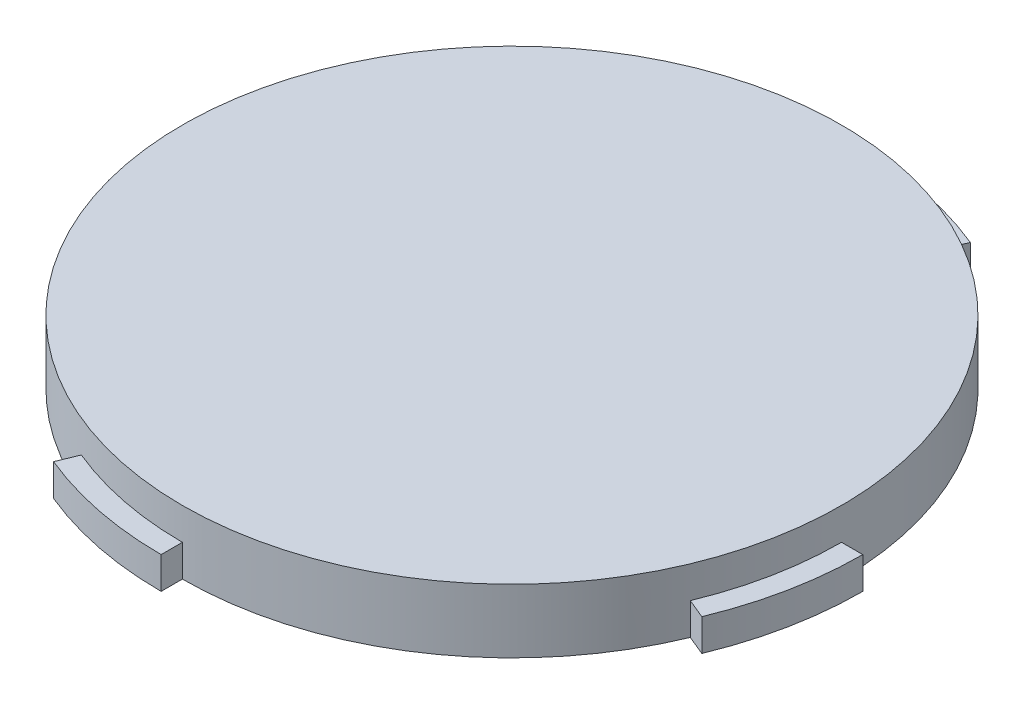
ISO-10303-21;
HEADER;
FILE_DESCRIPTION(('STEP AP214'),'2;1');
FILE_NAME('part.step','',(''),(''),'','','');
FILE_SCHEMA(('AUTOMOTIVE_DESIGN { 1 0 10303 214 1 1 1 1 }'));
ENDSEC;
DATA;
#1=APPLICATION_CONTEXT('core data for automotive mechanical design processes');
#2=APPLICATION_PROTOCOL_DEFINITION('international standard','automotive_design',2000,#1);
#3=PRODUCT_CONTEXT('',#1,'mechanical');
#4=PRODUCT('Part','Part','',(#3));
#5=PRODUCT_RELATED_PRODUCT_CATEGORY('part','',(#4));
#6=PRODUCT_DEFINITION_FORMATION('','',#4);
#7=PRODUCT_DEFINITION_CONTEXT('part definition',#1,'design');
#8=PRODUCT_DEFINITION('design','',#6,#7);
#9=PRODUCT_DEFINITION_SHAPE('','',#8);
#10=(LENGTH_UNIT() NAMED_UNIT(*) SI_UNIT(.MILLI.,.METRE.));
#11=(NAMED_UNIT(*) PLANE_ANGLE_UNIT() SI_UNIT($,.RADIAN.));
#12=(NAMED_UNIT(*) SI_UNIT($,.STERADIAN.) SOLID_ANGLE_UNIT());
#13=UNCERTAINTY_MEASURE_WITH_UNIT(LENGTH_MEASURE(1.E-05),#10,'distance_accuracy_value','');
#14=(GEOMETRIC_REPRESENTATION_CONTEXT(3) GLOBAL_UNCERTAINTY_ASSIGNED_CONTEXT((#13)) GLOBAL_UNIT_ASSIGNED_CONTEXT((#10,
#11,#12)) REPRESENTATION_CONTEXT('',''));
#15=CARTESIAN_POINT('',(0.,0.,0.));
#16=DIRECTION('',(0.,0.,1.));
#17=DIRECTION('',(1.,0.,0.));
#18=AXIS2_PLACEMENT_3D('',#15,#16,#17);
#19=CARTESIAN_POINT('',(0.,3.,0.));
#20=DIRECTION('',(0.,1.,0.));
#21=DIRECTION('',(0.,0.,1.));
#22=AXIS2_PLACEMENT_3D('',#19,#20,#21);
#23=PLANE('',#22);
#24=CARTESIAN_POINT('',(0.,3.,0.));
#25=DIRECTION('',(0.,1.,0.));
#26=DIRECTION('',(0.,0.,1.));
#27=AXIS2_PLACEMENT_3D('',#24,#25,#26);
#28=CIRCLE('',#27,31.);
#29=CARTESIAN_POINT('',(28.6402655078499,3.,11.8631864033178));
#30=VERTEX_POINT('',#29);
#31=CARTESIAN_POINT('',(31.,3.,0.));
#32=VERTEX_POINT('',#31);
#33=EDGE_CURVE('E11',#30,#32,#28,.T.);
#34=ORIENTED_EDGE('',*,*,#33,.F.);
#35=DIRECTION('',(0.923879532511287,0.,0.38268343236509));
#36=VECTOR('',#35,1.);
#37=CARTESIAN_POINT('',(0.,3.,0.));
#38=LINE('',#37,#36);
#39=CARTESIAN_POINT('',(30.4880245728725,3.,12.628553268048));
#40=VERTEX_POINT('',#39);
#41=EDGE_CURVE('E246',#30,#40,#38,.T.);
#42=ORIENTED_EDGE('',*,*,#41,.T.);
#43=CARTESIAN_POINT('',(0.,3.,0.));
#44=DIRECTION('',(0.,1.,0.));
#45=DIRECTION('',(0.,0.,1.));
#46=AXIS2_PLACEMENT_3D('',#43,#44,#45);
#47=CIRCLE('',#46,33.);
#48=CARTESIAN_POINT('',(33.,3.,0.));
#49=VERTEX_POINT('',#48);
#50=EDGE_CURVE('E335',#40,#49,#47,.T.);
#51=ORIENTED_EDGE('',*,*,#50,.T.);
#52=DIRECTION('',(1.,0.,0.));
#53=VECTOR('',#52,1.);
#54=CARTESIAN_POINT('',(0.,3.,0.));
#55=LINE('',#54,#53);
#56=EDGE_CURVE('E338',#32,#49,#55,.T.);
#57=ORIENTED_EDGE('',*,*,#56,.F.);
#58=EDGE_LOOP('',(#34,#42,#51,#57));
#59=FACE_BOUND('',#58,.T.);
#60=ADVANCED_FACE('F41',(#59),#23,.T.);
#61=CARTESIAN_POINT('',(11.8631864033178,3.,-28.6402655078499));
#62=VERTEX_POINT('',#61);
#63=CARTESIAN_POINT('',(0.,3.,-31.));
#64=VERTEX_POINT('',#63);
#65=EDGE_CURVE('E52',#62,#64,#28,.T.);
#66=ORIENTED_EDGE('',*,*,#65,.F.);
#67=DIRECTION('',(0.38268343236509,0.,-0.923879532511287));
#68=VECTOR('',#67,1.);
#69=CARTESIAN_POINT('',(0.,3.,0.));
#70=LINE('',#69,#68);
#71=CARTESIAN_POINT('',(12.628553268048,3.,-30.4880245728725));
#72=VERTEX_POINT('',#71);
#73=EDGE_CURVE('E342',#62,#72,#70,.T.);
#74=ORIENTED_EDGE('',*,*,#73,.T.);
#75=CARTESIAN_POINT('',(0.,3.,0.));
#76=DIRECTION('',(0.,1.,0.));
#77=DIRECTION('',(0.,0.,1.));
#78=AXIS2_PLACEMENT_3D('',#75,#76,#77);
#79=CIRCLE('',#78,33.);
#80=CARTESIAN_POINT('',(0.,3.,-33.));
#81=VERTEX_POINT('',#80);
#82=EDGE_CURVE('E345',#72,#81,#79,.T.);
#83=ORIENTED_EDGE('',*,*,#82,.T.);
#84=DIRECTION('',(0.,0.,1.));
#85=VECTOR('',#84,1.);
#86=CARTESIAN_POINT('',(0.,3.,0.));
#87=LINE('',#86,#85);
#88=EDGE_CURVE('E348',#81,#64,#87,.T.);
#89=ORIENTED_EDGE('',*,*,#88,.T.);
#90=EDGE_LOOP('',(#66,#74,#83,#89));
#91=FACE_BOUND('',#90,.T.);
#92=ADVANCED_FACE('F314',(#91),#23,.T.);
#93=CARTESIAN_POINT('',(-28.6402655078499,3.,-11.8631864033178));
#94=VERTEX_POINT('',#93);
#95=CARTESIAN_POINT('',(-31.,3.,0.));
#96=VERTEX_POINT('',#95);
#97=EDGE_CURVE('E172',#94,#96,#28,.T.);
#98=ORIENTED_EDGE('',*,*,#97,.F.);
#99=DIRECTION('',(0.923879532511287,0.,0.38268343236509));
#100=VECTOR('',#99,1.);
#101=CARTESIAN_POINT('',(0.,3.,0.));
#102=LINE('',#101,#100);
#103=CARTESIAN_POINT('',(-30.4880245728725,3.,-12.628553268048));
#104=VERTEX_POINT('',#103);
#105=EDGE_CURVE('E351',#104,#94,#102,.T.);
#106=ORIENTED_EDGE('',*,*,#105,.F.);
#107=CARTESIAN_POINT('',(0.,3.,0.));
#108=DIRECTION('',(0.,1.,0.));
#109=DIRECTION('',(0.,0.,1.));
#110=AXIS2_PLACEMENT_3D('',#107,#108,#109);
#111=CIRCLE('',#110,33.);
#112=CARTESIAN_POINT('',(-33.,3.,0.));
#113=VERTEX_POINT('',#112);
#114=EDGE_CURVE('E194',#104,#113,#111,.T.);
#115=ORIENTED_EDGE('',*,*,#114,.T.);
#116=DIRECTION('',(1.,0.,0.));
#117=VECTOR('',#116,1.);
#118=CARTESIAN_POINT('',(0.,3.,0.));
#119=LINE('',#118,#117);
#120=EDGE_CURVE('E189',#113,#96,#119,.T.);
#121=ORIENTED_EDGE('',*,*,#120,.T.);
#122=EDGE_LOOP('',(#98,#106,#115,#121));
#123=FACE_BOUND('',#122,.T.);
#124=ADVANCED_FACE('F309',(#123),#23,.T.);
#125=CARTESIAN_POINT('',(0.,3.,0.));
#126=DIRECTION('',(0.38268343236509,0.,-0.923879532511287));
#127=DIRECTION('',(-0.923879532511287,0.,-0.38268343236509));
#128=AXIS2_PLACEMENT_3D('',#125,#126,#127);
#129=PLANE('',#128);
#130=DIRECTION('',(0.923879532511287,0.,0.38268343236509));
#131=VECTOR('',#130,1.);
#132=CARTESIAN_POINT('',(0.,0.,0.));
#133=LINE('',#132,#131);
#134=CARTESIAN_POINT('',(28.6402655078499,0.,11.8631864033178));
#135=VERTEX_POINT('',#134);
#136=CARTESIAN_POINT('',(30.4880245728725,0.,12.628553268048));
#137=VERTEX_POINT('',#136);
#138=EDGE_CURVE('E203',#135,#137,#133,.T.);
#139=ORIENTED_EDGE('',*,*,#138,.T.);
#140=DIRECTION('',(0.,-1.,0.));
#141=VECTOR('',#140,1.);
#142=CARTESIAN_POINT('',(30.4880245728725,3.,12.628553268048));
#143=LINE('',#142,#141);
#144=EDGE_CURVE('E286',#40,#137,#143,.T.);
#145=ORIENTED_EDGE('',*,*,#144,.F.);
#146=ORIENTED_EDGE('',*,*,#41,.F.);
#147=DIRECTION('',(0.,-1.,0.));
#148=VECTOR('',#147,1.);
#149=CARTESIAN_POINT('',(28.6402655078499,3.,11.8631864033178));
#150=LINE('',#149,#148);
#151=EDGE_CURVE('E45',#30,#135,#150,.T.);
#152=ORIENTED_EDGE('',*,*,#151,.T.);
#153=EDGE_LOOP('',(#139,#145,#146,#152));
#154=FACE_BOUND('',#153,.T.);
#155=ADVANCED_FACE('F43',(#154),#129,.F.);
#156=CARTESIAN_POINT('',(0.,3.,0.));
#157=DIRECTION('',(0.,-1.,0.));
#158=DIRECTION('',(0.,0.,-1.));
#159=AXIS2_PLACEMENT_3D('',#156,#157,#158);
#160=CYLINDRICAL_SURFACE('',#159,33.);
#161=CARTESIAN_POINT('',(0.,0.,0.));
#162=DIRECTION('',(0.,1.,0.));
#163=DIRECTION('',(0.,0.,1.));
#164=AXIS2_PLACEMENT_3D('',#161,#162,#163);
#165=CIRCLE('',#164,33.);
#166=CARTESIAN_POINT('',(33.,0.,0.));
#167=VERTEX_POINT('',#166);
#168=EDGE_CURVE('E208',#137,#167,#165,.T.);
#169=ORIENTED_EDGE('',*,*,#168,.T.);
#170=DIRECTION('',(0.,-1.,0.));
#171=VECTOR('',#170,1.);
#172=CARTESIAN_POINT('',(33.,3.,0.));
#173=LINE('',#172,#171);
#174=EDGE_CURVE('E284',#49,#167,#173,.T.);
#175=ORIENTED_EDGE('',*,*,#174,.F.);
#176=ORIENTED_EDGE('',*,*,#50,.F.);
#177=ORIENTED_EDGE('',*,*,#144,.T.);
#178=EDGE_LOOP('',(#169,#175,#176,#177));
#179=FACE_BOUND('',#178,.T.);
#180=ADVANCED_FACE('F409',(#179),#160,.T.);
#181=CARTESIAN_POINT('',(0.,3.,0.));
#182=DIRECTION('',(0.,0.,-1.));
#183=DIRECTION('',(-1.,0.,0.));
#184=AXIS2_PLACEMENT_3D('',#181,#182,#183);
#185=PLANE('',#184);
#186=DIRECTION('',(1.,0.,0.));
#187=VECTOR('',#186,1.);
#188=CARTESIAN_POINT('',(0.,0.,0.));
#189=LINE('',#188,#187);
#190=CARTESIAN_POINT('',(31.,0.,0.));
#191=VERTEX_POINT('',#190);
#192=EDGE_CURVE('E212',#191,#167,#189,.T.);
#193=ORIENTED_EDGE('',*,*,#192,.F.);
#194=DIRECTION('',(0.,-1.,0.));
#195=VECTOR('',#194,1.);
#196=CARTESIAN_POINT('',(31.,3.,0.));
#197=LINE('',#196,#195);
#198=EDGE_CURVE('E281',#32,#191,#197,.T.);
#199=ORIENTED_EDGE('',*,*,#198,.F.);
#200=ORIENTED_EDGE('',*,*,#56,.T.);
#201=ORIENTED_EDGE('',*,*,#174,.T.);
#202=EDGE_LOOP('',(#193,#199,#200,#201));
#203=FACE_BOUND('',#202,.T.);
#204=ADVANCED_FACE('F404',(#203),#185,.T.);
#205=CARTESIAN_POINT('',(0.,3.,0.));
#206=DIRECTION('',(-0.923879532511286,0.,-0.38268343236509));
#207=DIRECTION('',(-0.38268343236509,0.,0.923879532511287));
#208=AXIS2_PLACEMENT_3D('',#205,#206,#207);
#209=PLANE('',#208);
#210=DIRECTION('',(0.38268343236509,0.,-0.923879532511287));
#211=VECTOR('',#210,1.);
#212=CARTESIAN_POINT('',(0.,0.,0.));
#213=LINE('',#212,#211);
#214=CARTESIAN_POINT('',(11.8631864033178,0.,-28.6402655078499));
#215=VERTEX_POINT('',#214);
#216=CARTESIAN_POINT('',(12.628553268048,0.,-30.4880245728725));
#217=VERTEX_POINT('',#216);
#218=EDGE_CURVE('E216',#215,#217,#213,.T.);
#219=ORIENTED_EDGE('',*,*,#218,.T.);
#220=DIRECTION('',(0.,-1.,0.));
#221=VECTOR('',#220,1.);
#222=CARTESIAN_POINT('',(12.628553268048,3.,-30.4880245728725));
#223=LINE('',#222,#221);
#224=EDGE_CURVE('E273',#72,#217,#223,.T.);
#225=ORIENTED_EDGE('',*,*,#224,.F.);
#226=ORIENTED_EDGE('',*,*,#73,.F.);
#227=DIRECTION('',(0.,-1.,0.));
#228=VECTOR('',#227,1.);
#229=CARTESIAN_POINT('',(11.8631864033178,3.,-28.6402655078499));
#230=LINE('',#229,#228);
#231=EDGE_CURVE('E277',#62,#215,#230,.T.);
#232=ORIENTED_EDGE('',*,*,#231,.T.);
#233=EDGE_LOOP('',(#219,#225,#226,#232));
#234=FACE_BOUND('',#233,.T.);
#235=ADVANCED_FACE('F393',(#234),#209,.F.);
#236=CARTESIAN_POINT('',(0.,3.,0.));
#237=DIRECTION('',(0.,-1.,0.));
#238=DIRECTION('',(0.,0.,-1.));
#239=AXIS2_PLACEMENT_3D('',#236,#237,#238);
#240=CYLINDRICAL_SURFACE('',#239,33.);
#241=CARTESIAN_POINT('',(0.,0.,0.));
#242=DIRECTION('',(0.,1.,0.));
#243=DIRECTION('',(0.,0.,1.));
#244=AXIS2_PLACEMENT_3D('',#241,#242,#243);
#245=CIRCLE('',#244,33.);
#246=CARTESIAN_POINT('',(0.,0.,-33.));
#247=VERTEX_POINT('',#246);
#248=EDGE_CURVE('E219',#217,#247,#245,.T.);
#249=ORIENTED_EDGE('',*,*,#248,.T.);
#250=DIRECTION('',(0.,-1.,0.));
#251=VECTOR('',#250,1.);
#252=CARTESIAN_POINT('',(0.,3.,-33.));
#253=LINE('',#252,#251);
#254=EDGE_CURVE('E269',#81,#247,#253,.T.);
#255=ORIENTED_EDGE('',*,*,#254,.F.);
#256=ORIENTED_EDGE('',*,*,#82,.F.);
#257=ORIENTED_EDGE('',*,*,#224,.T.);
#258=EDGE_LOOP('',(#249,#255,#256,#257));
#259=FACE_BOUND('',#258,.T.);
#260=ADVANCED_FACE('F395',(#259),#240,.T.);
#261=CARTESIAN_POINT('',(0.,3.,0.));
#262=DIRECTION('',(1.,0.,0.));
#263=DIRECTION('',(0.,0.,-1.));
#264=AXIS2_PLACEMENT_3D('',#261,#262,#263);
#265=PLANE('',#264);
#266=DIRECTION('',(0.,0.,1.));
#267=VECTOR('',#266,1.);
#268=CARTESIAN_POINT('',(0.,0.,0.));
#269=LINE('',#268,#267);
#270=CARTESIAN_POINT('',(0.,0.,-31.));
#271=VERTEX_POINT('',#270);
#272=EDGE_CURVE('E222',#247,#271,#269,.T.);
#273=ORIENTED_EDGE('',*,*,#272,.T.);
#274=DIRECTION('',(0.,-1.,0.));
#275=VECTOR('',#274,1.);
#276=CARTESIAN_POINT('',(0.,3.,-31.));
#277=LINE('',#276,#275);
#278=EDGE_CURVE('E265',#64,#271,#277,.T.);
#279=ORIENTED_EDGE('',*,*,#278,.F.);
#280=ORIENTED_EDGE('',*,*,#88,.F.);
#281=ORIENTED_EDGE('',*,*,#254,.T.);
#282=EDGE_LOOP('',(#273,#279,#280,#281));
#283=FACE_BOUND('',#282,.T.);
#284=ADVANCED_FACE('F382',(#283),#265,.F.);
#285=CARTESIAN_POINT('',(0.,3.,0.));
#286=DIRECTION('',(0.382683432365089,0.,-0.923879532511287));
#287=DIRECTION('',(-0.923879532511287,0.,-0.38268343236509));
#288=AXIS2_PLACEMENT_3D('',#285,#286,#287);
#289=PLANE('',#288);
#290=DIRECTION('',(0.923879532511287,0.,0.38268343236509));
#291=VECTOR('',#290,1.);
#292=CARTESIAN_POINT('',(0.,0.,0.));
#293=LINE('',#292,#291);
#294=CARTESIAN_POINT('',(-30.4880245728725,0.,-12.628553268048));
#295=VERTEX_POINT('',#294);
#296=CARTESIAN_POINT('',(-28.6402655078499,0.,-11.8631864033178));
#297=VERTEX_POINT('',#296);
#298=EDGE_CURVE('E226',#295,#297,#293,.T.);
#299=ORIENTED_EDGE('',*,*,#298,.F.);
#300=DIRECTION('',(0.,-1.,0.));
#301=VECTOR('',#300,1.);
#302=CARTESIAN_POINT('',(-30.4880245728725,3.,-12.628553268048));
#303=LINE('',#302,#301);
#304=EDGE_CURVE('E259',#104,#295,#303,.T.);
#305=ORIENTED_EDGE('',*,*,#304,.F.);
#306=ORIENTED_EDGE('',*,*,#105,.T.);
#307=DIRECTION('',(0.,-1.,0.));
#308=VECTOR('',#307,1.);
#309=CARTESIAN_POINT('',(-28.6402655078499,3.,-11.8631864033178));
#310=LINE('',#309,#308);
#311=EDGE_CURVE('E262',#94,#297,#310,.T.);
#312=ORIENTED_EDGE('',*,*,#311,.T.);
#313=EDGE_LOOP('',(#299,#305,#306,#312));
#314=FACE_BOUND('',#313,.T.);
#315=ADVANCED_FACE('F402',(#314),#289,.T.);
#316=CARTESIAN_POINT('',(0.,3.,0.));
#317=DIRECTION('',(0.,-1.,0.));
#318=DIRECTION('',(0.,0.,-1.));
#319=AXIS2_PLACEMENT_3D('',#316,#317,#318);
#320=CYLINDRICAL_SURFACE('',#319,33.);
#321=CARTESIAN_POINT('',(0.,0.,0.));
#322=DIRECTION('',(0.,1.,0.));
#323=DIRECTION('',(0.,0.,1.));
#324=AXIS2_PLACEMENT_3D('',#321,#322,#323);
#325=CIRCLE('',#324,33.);
#326=CARTESIAN_POINT('',(-33.,0.,0.));
#327=VERTEX_POINT('',#326);
#328=EDGE_CURVE('E230',#295,#327,#325,.T.);
#329=ORIENTED_EDGE('',*,*,#328,.T.);
#330=DIRECTION('',(0.,-1.,0.));
#331=VECTOR('',#330,1.);
#332=CARTESIAN_POINT('',(-33.,3.,0.));
#333=LINE('',#332,#331);
#334=EDGE_CURVE('E255',#113,#327,#333,.T.);
#335=ORIENTED_EDGE('',*,*,#334,.F.);
#336=ORIENTED_EDGE('',*,*,#114,.F.);
#337=ORIENTED_EDGE('',*,*,#304,.T.);
#338=EDGE_LOOP('',(#329,#335,#336,#337));
#339=FACE_BOUND('',#338,.T.);
#340=ADVANCED_FACE('F362',(#339),#320,.T.);
#341=CARTESIAN_POINT('',(0.,3.,0.));
#342=DIRECTION('',(0.,0.,-1.));
#343=DIRECTION('',(-1.,0.,0.));
#344=AXIS2_PLACEMENT_3D('',#341,#342,#343);
#345=PLANE('',#344);
#346=DIRECTION('',(1.,0.,0.));
#347=VECTOR('',#346,1.);
#348=CARTESIAN_POINT('',(0.,0.,0.));
#349=LINE('',#348,#347);
#350=CARTESIAN_POINT('',(-31.,0.,0.));
#351=VERTEX_POINT('',#350);
#352=EDGE_CURVE('E233',#327,#351,#349,.T.);
#353=ORIENTED_EDGE('',*,*,#352,.T.);
#354=DIRECTION('',(0.,-1.,0.));
#355=VECTOR('',#354,1.);
#356=CARTESIAN_POINT('',(-31.,3.,0.));
#357=LINE('',#356,#355);
#358=EDGE_CURVE('E184',#96,#351,#357,.T.);
#359=ORIENTED_EDGE('',*,*,#358,.F.);
#360=ORIENTED_EDGE('',*,*,#120,.F.);
#361=ORIENTED_EDGE('',*,*,#334,.T.);
#362=EDGE_LOOP('',(#353,#359,#360,#361));
#363=FACE_BOUND('',#362,.T.);
#364=ADVANCED_FACE('F366',(#363),#345,.F.);
#365=CARTESIAN_POINT('',(0.,3.,0.));
#366=DIRECTION('',(0.,-1.,0.));
#367=DIRECTION('',(0.,0.,-1.));
#368=AXIS2_PLACEMENT_3D('',#365,#366,#367);
#369=CYLINDRICAL_SURFACE('',#368,31.);
#370=CARTESIAN_POINT('',(0.,0.,0.));
#371=DIRECTION('',(0.,1.,0.));
#372=DIRECTION('',(0.,0.,1.));
#373=AXIS2_PLACEMENT_3D('',#370,#371,#372);
#374=CIRCLE('',#373,31.);
#375=CARTESIAN_POINT('',(-11.8631864033178,0.,28.6402655078499));
#376=VERTEX_POINT('',#375);
#377=EDGE_CURVE('E179',#351,#376,#374,.T.);
#378=ORIENTED_EDGE('',*,*,#377,.T.);
#379=DIRECTION('',(0.,-1.,0.));
#380=VECTOR('',#379,1.);
#381=CARTESIAN_POINT('',(-11.8631864033178,3.,28.6402655078499));
#382=LINE('',#381,#380);
#383=CARTESIAN_POINT('',(-11.8631864033178,3.,28.6402655078499));
#384=VERTEX_POINT('',#383);
#385=EDGE_CURVE('E174',#384,#376,#382,.T.);
#386=ORIENTED_EDGE('',*,*,#385,.F.);
#387=CARTESIAN_POINT('',(0.,3.,31.));
#388=VERTEX_POINT('',#387);
#389=EDGE_CURVE('E54',#384,#388,#28,.T.);
#390=ORIENTED_EDGE('',*,*,#389,.T.);
#391=DIRECTION('',(0.,-1.,0.));
#392=VECTOR('',#391,1.);
#393=CARTESIAN_POINT('',(0.,3.,31.));
#394=LINE('',#393,#392);
#395=CARTESIAN_POINT('',(0.,0.,31.));
#396=VERTEX_POINT('',#395);
#397=EDGE_CURVE('E124',#388,#396,#394,.T.);
#398=ORIENTED_EDGE('',*,*,#397,.T.);
#399=EDGE_CURVE('E200',#396,#135,#374,.T.);
#400=ORIENTED_EDGE('',*,*,#399,.T.);
#401=ORIENTED_EDGE('',*,*,#151,.F.);
#402=ORIENTED_EDGE('',*,*,#33,.T.);
#403=ORIENTED_EDGE('',*,*,#198,.T.);
#404=EDGE_CURVE('E205',#191,#215,#374,.T.);
#405=ORIENTED_EDGE('',*,*,#404,.T.);
#406=ORIENTED_EDGE('',*,*,#231,.F.);
#407=ORIENTED_EDGE('',*,*,#65,.T.);
#408=ORIENTED_EDGE('',*,*,#278,.T.);
#409=EDGE_CURVE('E225',#271,#297,#374,.T.);
#410=ORIENTED_EDGE('',*,*,#409,.T.);
#411=ORIENTED_EDGE('',*,*,#311,.F.);
#412=ORIENTED_EDGE('',*,*,#97,.T.);
#413=ORIENTED_EDGE('',*,*,#358,.T.);
#414=EDGE_LOOP('',(#378,#386,#390,#398,#400,#401,#402,#403,#405,#406,#407,#408,#410,#411,#412,#413));
#415=FACE_BOUND('',#414,.T.);
#416=CARTESIAN_POINT('',(0.,6.,0.));
#417=DIRECTION('',(0.,1.,0.));
#418=DIRECTION('',(0.,0.,1.));
#419=AXIS2_PLACEMENT_3D('',#416,#417,#418);
#420=CIRCLE('',#419,31.);
#421=CARTESIAN_POINT('',(0.,6.,31.));
#422=VERTEX_POINT('',#421);
#423=EDGE_CURVE('E204',#422,#422,#420,.T.);
#424=ORIENTED_EDGE('',*,*,#423,.F.);
#425=EDGE_LOOP('',(#424));
#426=FACE_BOUND('',#425,.T.);
#427=ADVANCED_FACE('F175',(#415,#426),#369,.T.);
#428=CARTESIAN_POINT('',(0.,3.,0.));
#429=DIRECTION('',(-0.923879532511287,0.,-0.38268343236509));
#430=DIRECTION('',(-0.38268343236509,0.,0.923879532511287));
#431=AXIS2_PLACEMENT_3D('',#428,#429,#430);
#432=PLANE('',#431);
#433=DIRECTION('',(0.38268343236509,0.,-0.923879532511287));
#434=VECTOR('',#433,1.);
#435=CARTESIAN_POINT('',(0.,0.,0.));
#436=LINE('',#435,#434);
#437=CARTESIAN_POINT('',(-12.628553268048,0.,30.4880245728725));
#438=VERTEX_POINT('',#437);
#439=EDGE_CURVE('E236',#438,#376,#436,.T.);
#440=ORIENTED_EDGE('',*,*,#439,.F.);
#441=DIRECTION('',(0.,-1.,0.));
#442=VECTOR('',#441,1.);
#443=CARTESIAN_POINT('',(-12.628553268048,3.,30.4880245728725));
#444=LINE('',#443,#442);
#445=CARTESIAN_POINT('',(-12.628553268048,3.,30.4880245728725));
#446=VERTEX_POINT('',#445);
#447=EDGE_CURVE('E185',#446,#438,#444,.T.);
#448=ORIENTED_EDGE('',*,*,#447,.F.);
#449=DIRECTION('',(0.38268343236509,0.,-0.923879532511287));
#450=VECTOR('',#449,1.);
#451=CARTESIAN_POINT('',(0.,3.,0.));
#452=LINE('',#451,#450);
#453=EDGE_CURVE('E169',#446,#384,#452,.T.);
#454=ORIENTED_EDGE('',*,*,#453,.T.);
#455=ORIENTED_EDGE('',*,*,#385,.T.);
#456=EDGE_LOOP('',(#440,#448,#454,#455));
#457=FACE_BOUND('',#456,.T.);
#458=ADVANCED_FACE('F187',(#457),#432,.T.);
#459=CARTESIAN_POINT('',(0.,3.,0.));
#460=DIRECTION('',(0.,-1.,0.));
#461=DIRECTION('',(0.,0.,-1.));
#462=AXIS2_PLACEMENT_3D('',#459,#460,#461);
#463=CYLINDRICAL_SURFACE('',#462,33.);
#464=CARTESIAN_POINT('',(0.,0.,0.));
#465=DIRECTION('',(0.,1.,0.));
#466=DIRECTION('',(0.,0.,1.));
#467=AXIS2_PLACEMENT_3D('',#464,#465,#466);
#468=CIRCLE('',#467,33.);
#469=CARTESIAN_POINT('',(0.,0.,33.));
#470=VERTEX_POINT('',#469);
#471=EDGE_CURVE('E239',#438,#470,#468,.T.);
#472=ORIENTED_EDGE('',*,*,#471,.T.);
#473=DIRECTION('',(0.,-1.,0.));
#474=VECTOR('',#473,1.);
#475=CARTESIAN_POINT('',(0.,3.,33.));
#476=LINE('',#475,#474);
#477=CARTESIAN_POINT('',(0.,3.,33.));
#478=VERTEX_POINT('',#477);
#479=EDGE_CURVE('E116',#478,#470,#476,.T.);
#480=ORIENTED_EDGE('',*,*,#479,.F.);
#481=CARTESIAN_POINT('',(0.,3.,0.));
#482=DIRECTION('',(0.,1.,0.));
#483=DIRECTION('',(0.,0.,1.));
#484=AXIS2_PLACEMENT_3D('',#481,#482,#483);
#485=CIRCLE('',#484,33.);
#486=EDGE_CURVE('E62',#446,#478,#485,.T.);
#487=ORIENTED_EDGE('',*,*,#486,.F.);
#488=ORIENTED_EDGE('',*,*,#447,.T.);
#489=EDGE_LOOP('',(#472,#480,#487,#488));
#490=FACE_BOUND('',#489,.T.);
#491=ADVANCED_FACE('F302',(#490),#463,.T.);
#492=CARTESIAN_POINT('',(0.,3.,0.));
#493=DIRECTION('',(1.,0.,0.));
#494=DIRECTION('',(0.,0.,-1.));
#495=AXIS2_PLACEMENT_3D('',#492,#493,#494);
#496=PLANE('',#495);
#497=DIRECTION('',(0.,0.,1.));
#498=VECTOR('',#497,1.);
#499=CARTESIAN_POINT('',(0.,0.,0.));
#500=LINE('',#499,#498);
#501=EDGE_CURVE('E242',#396,#470,#500,.T.);
#502=ORIENTED_EDGE('',*,*,#501,.F.);
#503=ORIENTED_EDGE('',*,*,#397,.F.);
#504=DIRECTION('',(0.,0.,1.));
#505=VECTOR('',#504,1.);
#506=CARTESIAN_POINT('',(0.,3.,0.));
#507=LINE('',#506,#505);
#508=EDGE_CURVE('E170',#388,#478,#507,.T.);
#509=ORIENTED_EDGE('',*,*,#508,.T.);
#510=ORIENTED_EDGE('',*,*,#479,.T.);
#511=EDGE_LOOP('',(#502,#503,#509,#510));
#512=FACE_BOUND('',#511,.T.);
#513=ADVANCED_FACE('F300',(#512),#496,.T.);
#514=ORIENTED_EDGE('',*,*,#389,.F.);
#515=ORIENTED_EDGE('',*,*,#453,.F.);
#516=ORIENTED_EDGE('',*,*,#486,.T.);
#517=ORIENTED_EDGE('',*,*,#508,.F.);
#518=EDGE_LOOP('',(#514,#515,#516,#517));
#519=FACE_BOUND('',#518,.T.);
#520=ADVANCED_FACE('F167',(#519),#23,.T.);
#521=CARTESIAN_POINT('',(0.,0.,0.));
#522=DIRECTION('',(0.,1.,0.));
#523=DIRECTION('',(0.,0.,1.));
#524=AXIS2_PLACEMENT_3D('',#521,#522,#523);
#525=PLANE('',#524);
#526=ORIENTED_EDGE('',*,*,#399,.F.);
#527=ORIENTED_EDGE('',*,*,#501,.T.);
#528=ORIENTED_EDGE('',*,*,#471,.F.);
#529=ORIENTED_EDGE('',*,*,#439,.T.);
#530=ORIENTED_EDGE('',*,*,#377,.F.);
#531=ORIENTED_EDGE('',*,*,#352,.F.);
#532=ORIENTED_EDGE('',*,*,#328,.F.);
#533=ORIENTED_EDGE('',*,*,#298,.T.);
#534=ORIENTED_EDGE('',*,*,#409,.F.);
#535=ORIENTED_EDGE('',*,*,#272,.F.);
#536=ORIENTED_EDGE('',*,*,#248,.F.);
#537=ORIENTED_EDGE('',*,*,#218,.F.);
#538=ORIENTED_EDGE('',*,*,#404,.F.);
#539=ORIENTED_EDGE('',*,*,#192,.T.);
#540=ORIENTED_EDGE('',*,*,#168,.F.);
#541=ORIENTED_EDGE('',*,*,#138,.F.);
#542=EDGE_LOOP('',(#526,#527,#528,#529,#530,#531,#532,#533,#534,#535,#536,#537,#538,#539,#540,#541));
#543=FACE_BOUND('',#542,.T.);
#544=ADVANCED_FACE('F298',(#543),#525,.F.);
#545=CARTESIAN_POINT('',(0.,6.,0.));
#546=DIRECTION('',(0.,1.,0.));
#547=DIRECTION('',(0.,0.,1.));
#548=AXIS2_PLACEMENT_3D('',#545,#546,#547);
#549=PLANE('',#548);
#550=ORIENTED_EDGE('',*,*,#423,.T.);
#551=EDGE_LOOP('',(#550));
#552=FACE_BOUND('',#551,.T.);
#553=ADVANCED_FACE('F320',(#552),#549,.T.);
#554=CLOSED_SHELL('',(#60,#92,#124,#155,#180,#204,#235,#260,#284,#315,#340,#364,#427,#458,#491,
#513,#520,#544,#553));
#555=MANIFOLD_SOLID_BREP('B2',#554);
#556=ADVANCED_BREP_SHAPE_REPRESENTATION('',(#18,#555),#14);
#557=SHAPE_DEFINITION_REPRESENTATION(#9,#556);
ENDSEC;
END-ISO-10303-21;
